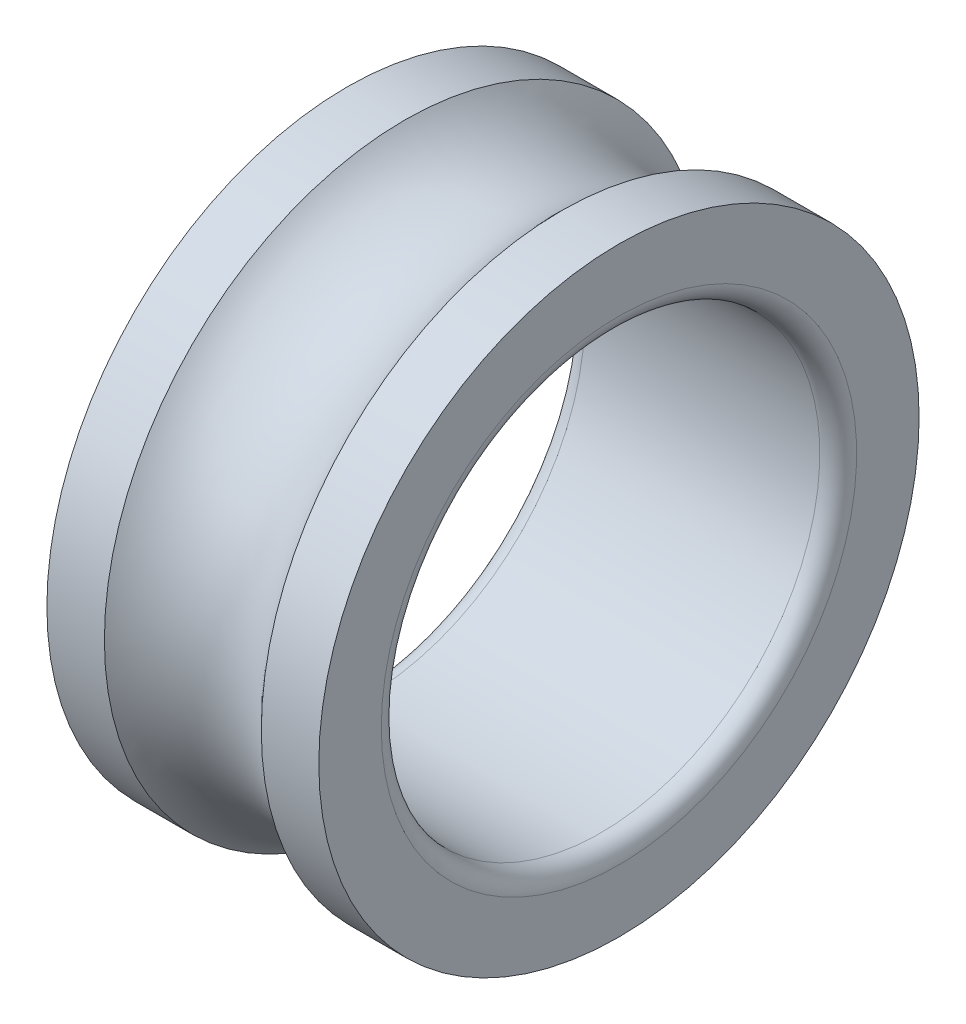
ISO-10303-21;
HEADER;
FILE_DESCRIPTION(('STEP AP214'),'2;1');
FILE_NAME('part.step','',(''),(''),'','','');
FILE_SCHEMA(('AUTOMOTIVE_DESIGN { 1 0 10303 214 1 1 1 1 }'));
ENDSEC;
DATA;
#1=APPLICATION_CONTEXT('core data for automotive mechanical design processes');
#2=APPLICATION_PROTOCOL_DEFINITION('international standard','automotive_design',2000,#1);
#3=PRODUCT_CONTEXT('',#1,'mechanical');
#4=PRODUCT('Part','Part','',(#3));
#5=PRODUCT_RELATED_PRODUCT_CATEGORY('part','',(#4));
#6=PRODUCT_DEFINITION_FORMATION('','',#4);
#7=PRODUCT_DEFINITION_CONTEXT('part definition',#1,'design');
#8=PRODUCT_DEFINITION('design','',#6,#7);
#9=PRODUCT_DEFINITION_SHAPE('','',#8);
#10=(LENGTH_UNIT() NAMED_UNIT(*) SI_UNIT(.MILLI.,.METRE.));
#11=(NAMED_UNIT(*) PLANE_ANGLE_UNIT() SI_UNIT($,.RADIAN.));
#12=(NAMED_UNIT(*) SI_UNIT($,.STERADIAN.) SOLID_ANGLE_UNIT());
#13=UNCERTAINTY_MEASURE_WITH_UNIT(LENGTH_MEASURE(1.E-05),#10,'distance_accuracy_value','');
#14=(GEOMETRIC_REPRESENTATION_CONTEXT(3) GLOBAL_UNCERTAINTY_ASSIGNED_CONTEXT((#13)) GLOBAL_UNIT_ASSIGNED_CONTEXT((#10,
#11,#12)) REPRESENTATION_CONTEXT('',''));
#15=CARTESIAN_POINT('',(0.,0.,0.));
#16=DIRECTION('',(0.,0.,1.));
#17=DIRECTION('',(1.,0.,0.));
#18=AXIS2_PLACEMENT_3D('',#15,#16,#17);
#19=CARTESIAN_POINT('',(-9.90672784246271,0.,0.));
#20=DIRECTION('',(-1.,0.,0.));
#21=DIRECTION('',(0.,0.,1.));
#22=AXIS2_PLACEMENT_3D('',#19,#20,#21);
#23=CYLINDRICAL_SURFACE('',#22,34.2209504473645);
#24=CARTESIAN_POINT('',(-12.2204084525433,0.,0.));
#25=DIRECTION('',(-1.,0.,0.));
#26=DIRECTION('',(0.,0.,1.));
#27=AXIS2_PLACEMENT_3D('',#24,#25,#26);
#28=CIRCLE('',#27,34.2209504473645);
#29=CARTESIAN_POINT('',(-12.2204084525433,0.,34.2209504473645));
#30=VERTEX_POINT('',#29);
#31=EDGE_CURVE('E59',#30,#30,#28,.T.);
#32=ORIENTED_EDGE('',*,*,#31,.F.);
#33=EDGE_LOOP('',(#32));
#34=FACE_BOUND('',#33,.T.);
#35=CARTESIAN_POINT('',(-5.66468036254248,0.,0.));
#36=DIRECTION('',(-1.,0.,0.));
#37=DIRECTION('',(0.,0.,1.));
#38=AXIS2_PLACEMENT_3D('',#35,#36,#37);
#39=CIRCLE('',#38,34.2209504473645);
#40=CARTESIAN_POINT('',(-5.66468036254248,0.,34.2209504473645));
#41=VERTEX_POINT('',#40);
#42=EDGE_CURVE('E10',#41,#41,#39,.T.);
#43=ORIENTED_EDGE('',*,*,#42,.T.);
#44=EDGE_LOOP('',(#43));
#45=FACE_BOUND('',#44,.T.);
#46=ADVANCED_FACE('F31',(#34,#45),#23,.T.);
#47=CARTESIAN_POINT('',(3.27959154745668,0.,0.));
#48=DIRECTION('',(-1.,0.,0.));
#49=DIRECTION('',(0.,0.,1.));
#50=AXIS2_PLACEMENT_3D('',#47,#48,#49);
#51=TOROIDAL_SURFACE('',#50,42.2209504473645,12.);
#52=ORIENTED_EDGE('',*,*,#42,.F.);
#53=EDGE_LOOP('',(#52));
#54=FACE_BOUND('',#53,.T.);
#55=CARTESIAN_POINT('',(12.2238634574558,0.,0.));
#56=DIRECTION('',(-1.,0.,0.));
#57=DIRECTION('',(0.,0.,1.));
#58=AXIS2_PLACEMENT_3D('',#55,#56,#57);
#59=CIRCLE('',#58,34.2209504473645);
#60=CARTESIAN_POINT('',(12.2238634574558,0.,34.2209504473645));
#61=VERTEX_POINT('',#60);
#62=EDGE_CURVE('E37',#61,#61,#59,.T.);
#63=ORIENTED_EDGE('',*,*,#62,.T.);
#64=EDGE_LOOP('',(#63));
#65=FACE_BOUND('',#64,.T.);
#66=ADVANCED_FACE('F66',(#54,#65),#51,.F.);
#67=CARTESIAN_POINT('',(-9.90672784246271,0.,0.));
#68=DIRECTION('',(-1.,0.,0.));
#69=DIRECTION('',(0.,0.,1.));
#70=AXIS2_PLACEMENT_3D('',#67,#68,#69);
#71=CYLINDRICAL_SURFACE('',#70,34.2209504473645);
#72=ORIENTED_EDGE('',*,*,#62,.F.);
#73=EDGE_LOOP('',(#72));
#74=FACE_BOUND('',#73,.T.);
#75=CARTESIAN_POINT('',(18.7795915474567,0.,0.));
#76=DIRECTION('',(-1.,0.,0.));
#77=DIRECTION('',(0.,0.,1.));
#78=AXIS2_PLACEMENT_3D('',#75,#76,#77);
#79=CIRCLE('',#78,34.2209504473645);
#80=CARTESIAN_POINT('',(18.7795915474567,0.,34.2209504473645));
#81=VERTEX_POINT('',#80);
#82=EDGE_CURVE('E41',#81,#81,#79,.T.);
#83=ORIENTED_EDGE('',*,*,#82,.T.);
#84=EDGE_LOOP('',(#83));
#85=FACE_BOUND('',#84,.T.);
#86=ADVANCED_FACE('F70',(#74,#85),#71,.T.);
#87=CARTESIAN_POINT('',(18.7795915474567,27.1,0.));
#88=DIRECTION('',(-1.,0.,0.));
#89=DIRECTION('',(0.,0.,1.));
#90=AXIS2_PLACEMENT_3D('',#87,#88,#89);
#91=PLANE('',#90);
#92=ORIENTED_EDGE('',*,*,#82,.F.);
#93=EDGE_LOOP('',(#92));
#94=FACE_BOUND('',#93,.T.);
#95=CARTESIAN_POINT('',(18.7795915474567,0.,0.));
#96=DIRECTION('',(-1.,0.,0.));
#97=DIRECTION('',(0.,0.,1.));
#98=AXIS2_PLACEMENT_3D('',#95,#96,#97);
#99=CIRCLE('',#98,27.1);
#100=CARTESIAN_POINT('',(18.7795915474567,0.,27.1));
#101=VERTEX_POINT('',#100);
#102=EDGE_CURVE('E45',#101,#101,#99,.T.);
#103=ORIENTED_EDGE('',*,*,#102,.T.);
#104=EDGE_LOOP('',(#103));
#105=FACE_BOUND('',#104,.T.);
#106=ADVANCED_FACE('F75',(#94,#105),#91,.F.);
#107=CARTESIAN_POINT('',(16.6795915474567,0.,0.));
#108=DIRECTION('',(-1.,0.,0.));
#109=DIRECTION('',(0.,0.,1.));
#110=AXIS2_PLACEMENT_3D('',#107,#108,#109);
#111=TOROIDAL_SURFACE('',#110,27.1,2.1);
#112=ORIENTED_EDGE('',*,*,#102,.F.);
#113=EDGE_LOOP('',(#112));
#114=FACE_BOUND('',#113,.T.);
#115=CARTESIAN_POINT('',(16.6795915474567,0.,0.));
#116=DIRECTION('',(-1.,0.,0.));
#117=DIRECTION('',(0.,0.,1.));
#118=AXIS2_PLACEMENT_3D('',#115,#116,#117);
#119=CIRCLE('',#118,25.);
#120=CARTESIAN_POINT('',(16.6795915474567,0.,25.));
#121=VERTEX_POINT('',#120);
#122=EDGE_CURVE('E50',#121,#121,#119,.T.);
#123=ORIENTED_EDGE('',*,*,#122,.T.);
#124=EDGE_LOOP('',(#123));
#125=FACE_BOUND('',#124,.T.);
#126=ADVANCED_FACE('F81',(#114,#125),#111,.T.);
#127=CARTESIAN_POINT('',(-9.90672784246271,0.,0.));
#128=DIRECTION('',(-1.,0.,0.));
#129=DIRECTION('',(0.,0.,1.));
#130=AXIS2_PLACEMENT_3D('',#127,#128,#129);
#131=CYLINDRICAL_SURFACE('',#130,25.);
#132=ORIENTED_EDGE('',*,*,#122,.F.);
#133=EDGE_LOOP('',(#132));
#134=FACE_BOUND('',#133,.T.);
#135=CARTESIAN_POINT('',(-10.1204084525433,0.,0.));
#136=DIRECTION('',(-1.,0.,0.));
#137=DIRECTION('',(0.,0.,1.));
#138=AXIS2_PLACEMENT_3D('',#135,#136,#137);
#139=CIRCLE('',#138,25.);
#140=CARTESIAN_POINT('',(-10.1204084525433,0.,25.));
#141=VERTEX_POINT('',#140);
#142=EDGE_CURVE('E53',#141,#141,#139,.T.);
#143=ORIENTED_EDGE('',*,*,#142,.T.);
#144=EDGE_LOOP('',(#143));
#145=FACE_BOUND('',#144,.T.);
#146=ADVANCED_FACE('F85',(#134,#145),#131,.F.);
#147=CARTESIAN_POINT('',(-10.1204084525433,0.,0.));
#148=DIRECTION('',(-1.,0.,0.));
#149=DIRECTION('',(0.,0.,1.));
#150=AXIS2_PLACEMENT_3D('',#147,#148,#149);
#151=TOROIDAL_SURFACE('',#150,27.1,2.1);
#152=ORIENTED_EDGE('',*,*,#142,.F.);
#153=EDGE_LOOP('',(#152));
#154=FACE_BOUND('',#153,.T.);
#155=CARTESIAN_POINT('',(-12.2204084525433,0.,0.));
#156=DIRECTION('',(-1.,0.,0.));
#157=DIRECTION('',(0.,0.,1.));
#158=AXIS2_PLACEMENT_3D('',#155,#156,#157);
#159=CIRCLE('',#158,27.1);
#160=CARTESIAN_POINT('',(-12.2204084525433,0.,27.1));
#161=VERTEX_POINT('',#160);
#162=EDGE_CURVE('E56',#161,#161,#159,.T.);
#163=ORIENTED_EDGE('',*,*,#162,.T.);
#164=EDGE_LOOP('',(#163));
#165=FACE_BOUND('',#164,.T.);
#166=ADVANCED_FACE('F89',(#154,#165),#151,.T.);
#167=CARTESIAN_POINT('',(-12.2204084525433,27.1,0.));
#168=DIRECTION('',(1.,0.,0.));
#169=DIRECTION('',(0.,0.,-1.));
#170=AXIS2_PLACEMENT_3D('',#167,#168,#169);
#171=PLANE('',#170);
#172=ORIENTED_EDGE('',*,*,#162,.F.);
#173=EDGE_LOOP('',(#172));
#174=FACE_BOUND('',#173,.T.);
#175=ORIENTED_EDGE('',*,*,#31,.T.);
#176=EDGE_LOOP('',(#175));
#177=FACE_BOUND('',#176,.T.);
#178=ADVANCED_FACE('F63',(#174,#177),#171,.F.);
#179=CLOSED_SHELL('',(#46,#66,#86,#106,#126,#146,#166,#178));
#180=MANIFOLD_SOLID_BREP('B2',#179);
#181=ADVANCED_BREP_SHAPE_REPRESENTATION('',(#18,#180),#14);
#182=SHAPE_DEFINITION_REPRESENTATION(#9,#181);
ENDSEC;
END-ISO-10303-21;
